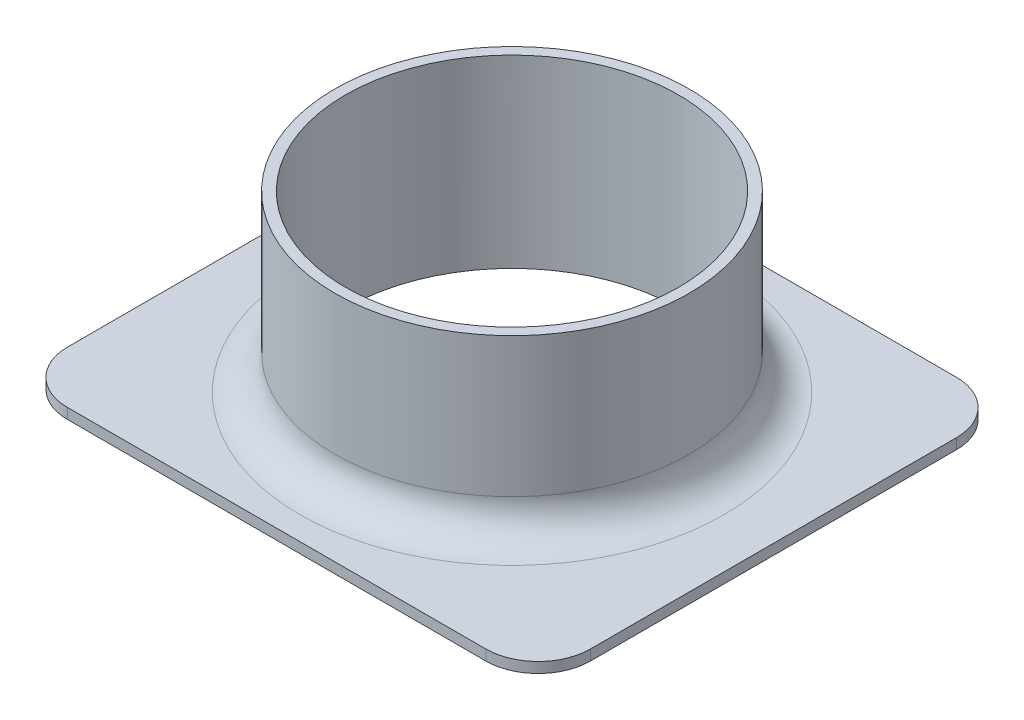
ISO-10303-21;
HEADER;
FILE_DESCRIPTION(('STEP AP214'),'2;1');
FILE_NAME('part.step','',(''),(''),'','','');
FILE_SCHEMA(('AUTOMOTIVE_DESIGN { 1 0 10303 214 1 1 1 1 }'));
ENDSEC;
DATA;
#1=APPLICATION_CONTEXT('core data for automotive mechanical design processes');
#2=APPLICATION_PROTOCOL_DEFINITION('international standard','automotive_design',2000,#1);
#3=PRODUCT_CONTEXT('',#1,'mechanical');
#4=PRODUCT('Part','Part','',(#3));
#5=PRODUCT_RELATED_PRODUCT_CATEGORY('part','',(#4));
#6=PRODUCT_DEFINITION_FORMATION('','',#4);
#7=PRODUCT_DEFINITION_CONTEXT('part definition',#1,'design');
#8=PRODUCT_DEFINITION('design','',#6,#7);
#9=PRODUCT_DEFINITION_SHAPE('','',#8);
#10=(LENGTH_UNIT() NAMED_UNIT(*) SI_UNIT(.MILLI.,.METRE.));
#11=(NAMED_UNIT(*) PLANE_ANGLE_UNIT() SI_UNIT($,.RADIAN.));
#12=(NAMED_UNIT(*) SI_UNIT($,.STERADIAN.) SOLID_ANGLE_UNIT());
#13=UNCERTAINTY_MEASURE_WITH_UNIT(LENGTH_MEASURE(1.E-05),#10,'distance_accuracy_value','');
#14=(GEOMETRIC_REPRESENTATION_CONTEXT(3) GLOBAL_UNCERTAINTY_ASSIGNED_CONTEXT((#13)) GLOBAL_UNIT_ASSIGNED_CONTEXT((#10,
#11,#12)) REPRESENTATION_CONTEXT('',''));
#15=CARTESIAN_POINT('',(0.,0.,0.));
#16=DIRECTION('',(0.,0.,1.));
#17=DIRECTION('',(1.,0.,0.));
#18=AXIS2_PLACEMENT_3D('',#15,#16,#17);
#19=CARTESIAN_POINT('',(0.,50.,0.));
#20=DIRECTION('',(0.,1.,0.));
#21=DIRECTION('',(0.,0.,1.));
#22=AXIS2_PLACEMENT_3D('',#19,#20,#21);
#23=PLANE('',#22);
#24=CARTESIAN_POINT('',(0.,50.,0.));
#25=DIRECTION('',(0.,1.,0.));
#26=DIRECTION('',(0.,0.,1.));
#27=AXIS2_PLACEMENT_3D('',#24,#25,#26);
#28=CIRCLE('',#27,50.8);
#29=CARTESIAN_POINT('',(0.,50.,50.8));
#30=VERTEX_POINT('',#29);
#31=EDGE_CURVE('E151',#30,#30,#28,.T.);
#32=ORIENTED_EDGE('',*,*,#31,.T.);
#33=EDGE_LOOP('',(#32));
#34=FACE_BOUND('',#33,.T.);
#35=CARTESIAN_POINT('',(0.,50.,0.));
#36=DIRECTION('',(0.,1.,0.));
#37=DIRECTION('',(1.,0.,0.));
#38=AXIS2_PLACEMENT_3D('',#35,#36,#37);
#39=CIRCLE('',#38,47.8);
#40=CARTESIAN_POINT('',(47.8,50.,0.));
#41=VERTEX_POINT('',#40);
#42=EDGE_CURVE('E148',#41,#41,#39,.T.);
#43=ORIENTED_EDGE('',*,*,#42,.F.);
#44=EDGE_LOOP('',(#43));
#45=FACE_BOUND('',#44,.T.);
#46=ADVANCED_FACE('F47',(#34,#45),#23,.T.);
#47=CARTESIAN_POINT('',(0.,50.,0.));
#48=DIRECTION('',(0.,-1.,0.));
#49=DIRECTION('',(0.,0.,-1.));
#50=AXIS2_PLACEMENT_3D('',#47,#48,#49);
#51=CYLINDRICAL_SURFACE('',#50,50.8);
#52=CARTESIAN_POINT('',(0.,10.,0.));
#53=DIRECTION('',(0.,1.,0.));
#54=DIRECTION('',(0.,0.,1.));
#55=AXIS2_PLACEMENT_3D('',#52,#53,#54);
#56=CIRCLE('',#55,50.8);
#57=CARTESIAN_POINT('',(0.,10.,50.8));
#58=VERTEX_POINT('',#57);
#59=EDGE_CURVE('E154',#58,#58,#56,.T.);
#60=ORIENTED_EDGE('',*,*,#59,.T.);
#61=EDGE_LOOP('',(#60));
#62=FACE_BOUND('',#61,.T.);
#63=ORIENTED_EDGE('',*,*,#31,.F.);
#64=EDGE_LOOP('',(#63));
#65=FACE_BOUND('',#64,.T.);
#66=ADVANCED_FACE('F219',(#62,#65),#51,.T.);
#67=CARTESIAN_POINT('',(0.,50.,0.));
#68=DIRECTION('',(0.,-1.,0.));
#69=DIRECTION('',(0.,0.,-1.));
#70=AXIS2_PLACEMENT_3D('',#67,#68,#69);
#71=CYLINDRICAL_SURFACE('',#70,47.8);
#72=ORIENTED_EDGE('',*,*,#42,.T.);
#73=EDGE_LOOP('',(#72));
#74=FACE_BOUND('',#73,.T.);
#75=CARTESIAN_POINT('',(0.,-3.,0.));
#76=DIRECTION('',(0.,1.,0.));
#77=DIRECTION('',(0.,0.,1.));
#78=AXIS2_PLACEMENT_3D('',#75,#76,#77);
#79=CIRCLE('',#78,47.8);
#80=CARTESIAN_POINT('',(0.,-3.,47.8));
#81=VERTEX_POINT('',#80);
#82=EDGE_CURVE('E189',#81,#81,#79,.T.);
#83=ORIENTED_EDGE('',*,*,#82,.F.);
#84=EDGE_LOOP('',(#83));
#85=FACE_BOUND('',#84,.T.);
#86=ADVANCED_FACE('F225',(#74,#85),#71,.F.);
#87=CARTESIAN_POINT('',(-75.,-3.,67.5));
#88=DIRECTION('',(1.,0.,0.));
#89=DIRECTION('',(0.,0.,-1.));
#90=AXIS2_PLACEMENT_3D('',#87,#88,#89);
#91=PLANE('',#90);
#92=DIRECTION('',(0.,0.,-1.));
#93=VECTOR('',#92,1.);
#94=CARTESIAN_POINT('',(-75.,-3.,67.5));
#95=LINE('',#94,#93);
#96=CARTESIAN_POINT('',(-75.,-3.,52.5));
#97=VERTEX_POINT('',#96);
#98=CARTESIAN_POINT('',(-75.,-3.,-52.5));
#99=VERTEX_POINT('',#98);
#100=EDGE_CURVE('E139',#97,#99,#95,.T.);
#101=ORIENTED_EDGE('',*,*,#100,.F.);
#102=DIRECTION('',(0.,1.,0.));
#103=VECTOR('',#102,1.);
#104=CARTESIAN_POINT('',(-75.,-3.,52.5));
#105=LINE('',#104,#103);
#106=CARTESIAN_POINT('',(-75.,0.,52.5));
#107=VERTEX_POINT('',#106);
#108=EDGE_CURVE('E177',#97,#107,#105,.T.);
#109=ORIENTED_EDGE('',*,*,#108,.T.);
#110=DIRECTION('',(0.,0.,-1.));
#111=VECTOR('',#110,1.);
#112=CARTESIAN_POINT('',(-75.,0.,67.5));
#113=LINE('',#112,#111);
#114=CARTESIAN_POINT('',(-75.,0.,-52.5));
#115=VERTEX_POINT('',#114);
#116=EDGE_CURVE('E184',#107,#115,#113,.T.);
#117=ORIENTED_EDGE('',*,*,#116,.T.);
#118=DIRECTION('',(0.,1.,0.));
#119=VECTOR('',#118,1.);
#120=CARTESIAN_POINT('',(-75.,-3.,-52.5));
#121=LINE('',#120,#119);
#122=EDGE_CURVE('E175',#115,#99,#121,.F.);
#123=ORIENTED_EDGE('',*,*,#122,.T.);
#124=EDGE_LOOP('',(#101,#109,#117,#123));
#125=FACE_BOUND('',#124,.T.);
#126=ADVANCED_FACE('F183',(#125),#91,.F.);
#127=CARTESIAN_POINT('',(75.,-3.,-67.5));
#128=DIRECTION('',(0.,0.,1.));
#129=DIRECTION('',(1.,0.,0.));
#130=AXIS2_PLACEMENT_3D('',#127,#128,#129);
#131=PLANE('',#130);
#132=DIRECTION('',(1.,0.,0.));
#133=VECTOR('',#132,1.);
#134=CARTESIAN_POINT('',(75.,-3.,-67.5));
#135=LINE('',#134,#133);
#136=CARTESIAN_POINT('',(-60.,-3.,-67.5));
#137=VERTEX_POINT('',#136);
#138=CARTESIAN_POINT('',(60.,-3.,-67.5));
#139=VERTEX_POINT('',#138);
#140=EDGE_CURVE('E142',#137,#139,#135,.T.);
#141=ORIENTED_EDGE('',*,*,#140,.F.);
#142=DIRECTION('',(0.,1.,0.));
#143=VECTOR('',#142,1.);
#144=CARTESIAN_POINT('',(-60.,-3.,-67.5));
#145=LINE('',#144,#143);
#146=CARTESIAN_POINT('',(-60.,0.,-67.5));
#147=VERTEX_POINT('',#146);
#148=EDGE_CURVE('E12',#137,#147,#145,.T.);
#149=ORIENTED_EDGE('',*,*,#148,.T.);
#150=DIRECTION('',(1.,0.,0.));
#151=VECTOR('',#150,1.);
#152=CARTESIAN_POINT('',(75.,0.,-67.5));
#153=LINE('',#152,#151);
#154=CARTESIAN_POINT('',(60.,0.,-67.5));
#155=VERTEX_POINT('',#154);
#156=EDGE_CURVE('E144',#147,#155,#153,.T.);
#157=ORIENTED_EDGE('',*,*,#156,.T.);
#158=DIRECTION('',(0.,1.,0.));
#159=VECTOR('',#158,1.);
#160=CARTESIAN_POINT('',(60.,-3.,-67.5));
#161=LINE('',#160,#159);
#162=EDGE_CURVE('E55',#155,#139,#161,.F.);
#163=ORIENTED_EDGE('',*,*,#162,.T.);
#164=EDGE_LOOP('',(#141,#149,#157,#163));
#165=FACE_BOUND('',#164,.T.);
#166=ADVANCED_FACE('F206',(#165),#131,.F.);
#167=CARTESIAN_POINT('',(75.,-3.,67.5));
#168=DIRECTION('',(-1.,0.,0.));
#169=DIRECTION('',(0.,0.,1.));
#170=AXIS2_PLACEMENT_3D('',#167,#168,#169);
#171=PLANE('',#170);
#172=DIRECTION('',(0.,0.,1.));
#173=VECTOR('',#172,1.);
#174=CARTESIAN_POINT('',(75.,0.,67.5));
#175=LINE('',#174,#173);
#176=CARTESIAN_POINT('',(75.,0.,-52.5));
#177=VERTEX_POINT('',#176);
#178=CARTESIAN_POINT('',(75.,0.,52.5));
#179=VERTEX_POINT('',#178);
#180=EDGE_CURVE('E140',#177,#179,#175,.T.);
#181=ORIENTED_EDGE('',*,*,#180,.T.);
#182=DIRECTION('',(0.,1.,0.));
#183=VECTOR('',#182,1.);
#184=CARTESIAN_POINT('',(75.,-3.,52.5));
#185=LINE('',#184,#183);
#186=CARTESIAN_POINT('',(75.,-3.,52.5));
#187=VERTEX_POINT('',#186);
#188=EDGE_CURVE('E118',#179,#187,#185,.F.);
#189=ORIENTED_EDGE('',*,*,#188,.T.);
#190=DIRECTION('',(0.,0.,1.));
#191=VECTOR('',#190,1.);
#192=CARTESIAN_POINT('',(75.,-3.,67.5));
#193=LINE('',#192,#191);
#194=CARTESIAN_POINT('',(75.,-3.,-52.5));
#195=VERTEX_POINT('',#194);
#196=EDGE_CURVE('E195',#195,#187,#193,.T.);
#197=ORIENTED_EDGE('',*,*,#196,.F.);
#198=DIRECTION('',(0.,1.,0.));
#199=VECTOR('',#198,1.);
#200=CARTESIAN_POINT('',(75.,-3.,-52.5));
#201=LINE('',#200,#199);
#202=EDGE_CURVE('E123',#195,#177,#201,.T.);
#203=ORIENTED_EDGE('',*,*,#202,.T.);
#204=EDGE_LOOP('',(#181,#189,#197,#203));
#205=FACE_BOUND('',#204,.T.);
#206=ADVANCED_FACE('F205',(#205),#171,.F.);
#207=CARTESIAN_POINT('',(75.,-3.,67.5));
#208=DIRECTION('',(0.,0.,-1.));
#209=DIRECTION('',(-1.,0.,0.));
#210=AXIS2_PLACEMENT_3D('',#207,#208,#209);
#211=PLANE('',#210);
#212=DIRECTION('',(-1.,0.,0.));
#213=VECTOR('',#212,1.);
#214=CARTESIAN_POINT('',(75.,-3.,67.5));
#215=LINE('',#214,#213);
#216=CARTESIAN_POINT('',(60.,-3.,67.5));
#217=VERTEX_POINT('',#216);
#218=CARTESIAN_POINT('',(-60.,-3.,67.5));
#219=VERTEX_POINT('',#218);
#220=EDGE_CURVE('E133',#217,#219,#215,.T.);
#221=ORIENTED_EDGE('',*,*,#220,.F.);
#222=DIRECTION('',(0.,1.,0.));
#223=VECTOR('',#222,1.);
#224=CARTESIAN_POINT('',(60.,-3.,67.5));
#225=LINE('',#224,#223);
#226=CARTESIAN_POINT('',(60.,0.,67.5));
#227=VERTEX_POINT('',#226);
#228=EDGE_CURVE('E117',#217,#227,#225,.T.);
#229=ORIENTED_EDGE('',*,*,#228,.T.);
#230=DIRECTION('',(-1.,0.,0.));
#231=VECTOR('',#230,1.);
#232=CARTESIAN_POINT('',(75.,0.,67.5));
#233=LINE('',#232,#231);
#234=CARTESIAN_POINT('',(-60.,0.,67.5));
#235=VERTEX_POINT('',#234);
#236=EDGE_CURVE('E130',#227,#235,#233,.T.);
#237=ORIENTED_EDGE('',*,*,#236,.T.);
#238=DIRECTION('',(0.,1.,0.));
#239=VECTOR('',#238,1.);
#240=CARTESIAN_POINT('',(-60.,-3.,67.5));
#241=LINE('',#240,#239);
#242=EDGE_CURVE('E135',#235,#219,#241,.F.);
#243=ORIENTED_EDGE('',*,*,#242,.T.);
#244=EDGE_LOOP('',(#221,#229,#237,#243));
#245=FACE_BOUND('',#244,.T.);
#246=ADVANCED_FACE('F129',(#245),#211,.F.);
#247=CARTESIAN_POINT('',(0.,-3.,0.));
#248=DIRECTION('',(0.,1.,0.));
#249=DIRECTION('',(0.,0.,1.));
#250=AXIS2_PLACEMENT_3D('',#247,#248,#249);
#251=PLANE('',#250);
#252=ORIENTED_EDGE('',*,*,#82,.T.);
#253=EDGE_LOOP('',(#252));
#254=FACE_BOUND('',#253,.T.);
#255=ORIENTED_EDGE('',*,*,#196,.T.);
#256=CARTESIAN_POINT('',(60.,-3.,52.5));
#257=DIRECTION('',(0.,1.,0.));
#258=DIRECTION('',(0.,0.,1.));
#259=AXIS2_PLACEMENT_3D('',#256,#257,#258);
#260=CIRCLE('',#259,15.);
#261=EDGE_CURVE('E173',#187,#217,#260,.F.);
#262=ORIENTED_EDGE('',*,*,#261,.T.);
#263=ORIENTED_EDGE('',*,*,#220,.T.);
#264=CARTESIAN_POINT('',(-60.,-3.,52.5));
#265=DIRECTION('',(0.,1.,0.));
#266=DIRECTION('',(0.,0.,1.));
#267=AXIS2_PLACEMENT_3D('',#264,#265,#266);
#268=CIRCLE('',#267,15.);
#269=EDGE_CURVE('E171',#219,#97,#268,.F.);
#270=ORIENTED_EDGE('',*,*,#269,.T.);
#271=ORIENTED_EDGE('',*,*,#100,.T.);
#272=CARTESIAN_POINT('',(-60.,-3.,-52.5));
#273=DIRECTION('',(0.,1.,0.));
#274=DIRECTION('',(0.,0.,1.));
#275=AXIS2_PLACEMENT_3D('',#272,#273,#274);
#276=CIRCLE('',#275,15.);
#277=EDGE_CURVE('E68',#99,#137,#276,.F.);
#278=ORIENTED_EDGE('',*,*,#277,.T.);
#279=ORIENTED_EDGE('',*,*,#140,.T.);
#280=CARTESIAN_POINT('',(60.,-3.,-52.5));
#281=DIRECTION('',(0.,1.,0.));
#282=DIRECTION('',(0.,0.,1.));
#283=AXIS2_PLACEMENT_3D('',#280,#281,#282);
#284=CIRCLE('',#283,15.);
#285=EDGE_CURVE('E168',#139,#195,#284,.F.);
#286=ORIENTED_EDGE('',*,*,#285,.T.);
#287=EDGE_LOOP('',(#255,#262,#263,#270,#271,#278,#279,#286));
#288=FACE_BOUND('',#287,.T.);
#289=ADVANCED_FACE('F199',(#254,#288),#251,.F.);
#290=CARTESIAN_POINT('',(0.,0.,0.));
#291=DIRECTION('',(0.,1.,0.));
#292=DIRECTION('',(0.,0.,1.));
#293=AXIS2_PLACEMENT_3D('',#290,#291,#292);
#294=PLANE('',#293);
#295=CARTESIAN_POINT('',(0.,0.,0.));
#296=DIRECTION('',(0.,1.,0.));
#297=DIRECTION('',(0.,0.,1.));
#298=AXIS2_PLACEMENT_3D('',#295,#296,#297);
#299=CIRCLE('',#298,60.8);
#300=CARTESIAN_POINT('',(0.,0.,60.8));
#301=VERTEX_POINT('',#300);
#302=EDGE_CURVE('E157',#301,#301,#299,.F.);
#303=ORIENTED_EDGE('',*,*,#302,.T.);
#304=EDGE_LOOP('',(#303));
#305=FACE_BOUND('',#304,.T.);
#306=ORIENTED_EDGE('',*,*,#236,.F.);
#307=CARTESIAN_POINT('',(60.,0.,52.5));
#308=DIRECTION('',(0.,1.,0.));
#309=DIRECTION('',(0.,0.,1.));
#310=AXIS2_PLACEMENT_3D('',#307,#308,#309);
#311=CIRCLE('',#310,15.);
#312=EDGE_CURVE('E113',#227,#179,#311,.T.);
#313=ORIENTED_EDGE('',*,*,#312,.T.);
#314=ORIENTED_EDGE('',*,*,#180,.F.);
#315=CARTESIAN_POINT('',(60.,0.,-52.5));
#316=DIRECTION('',(0.,1.,0.));
#317=DIRECTION('',(0.,0.,1.));
#318=AXIS2_PLACEMENT_3D('',#315,#316,#317);
#319=CIRCLE('',#318,15.);
#320=EDGE_CURVE('E134',#177,#155,#319,.T.);
#321=ORIENTED_EDGE('',*,*,#320,.T.);
#322=ORIENTED_EDGE('',*,*,#156,.F.);
#323=CARTESIAN_POINT('',(-60.,0.,-52.5));
#324=DIRECTION('',(0.,1.,0.));
#325=DIRECTION('',(0.,0.,1.));
#326=AXIS2_PLACEMENT_3D('',#323,#324,#325);
#327=CIRCLE('',#326,15.);
#328=EDGE_CURVE('E162',#147,#115,#327,.T.);
#329=ORIENTED_EDGE('',*,*,#328,.T.);
#330=ORIENTED_EDGE('',*,*,#116,.F.);
#331=CARTESIAN_POINT('',(-60.,0.,52.5));
#332=DIRECTION('',(0.,1.,0.));
#333=DIRECTION('',(0.,0.,1.));
#334=AXIS2_PLACEMENT_3D('',#331,#332,#333);
#335=CIRCLE('',#334,15.);
#336=EDGE_CURVE('E124',#107,#235,#335,.T.);
#337=ORIENTED_EDGE('',*,*,#336,.T.);
#338=EDGE_LOOP('',(#306,#313,#314,#321,#322,#329,#330,#337));
#339=FACE_BOUND('',#338,.T.);
#340=ADVANCED_FACE('F137',(#305,#339),#294,.T.);
#341=CARTESIAN_POINT('',(0.,10.,0.));
#342=DIRECTION('',(0.,1.,0.));
#343=DIRECTION('',(0.,0.,1.));
#344=AXIS2_PLACEMENT_3D('',#341,#342,#343);
#345=TOROIDAL_SURFACE('',#344,60.8,10.);
#346=ORIENTED_EDGE('',*,*,#302,.F.);
#347=EDGE_LOOP('',(#346));
#348=FACE_BOUND('',#347,.T.);
#349=ORIENTED_EDGE('',*,*,#59,.F.);
#350=EDGE_LOOP('',(#349));
#351=FACE_BOUND('',#350,.T.);
#352=ADVANCED_FACE('F216',(#348,#351),#345,.F.);
#353=CARTESIAN_POINT('',(60.,-3.,52.5));
#354=DIRECTION('',(0.,1.,0.));
#355=DIRECTION('',(0.,0.,1.));
#356=AXIS2_PLACEMENT_3D('',#353,#354,#355);
#357=CYLINDRICAL_SURFACE('',#356,15.);
#358=ORIENTED_EDGE('',*,*,#261,.F.);
#359=ORIENTED_EDGE('',*,*,#188,.F.);
#360=ORIENTED_EDGE('',*,*,#312,.F.);
#361=ORIENTED_EDGE('',*,*,#228,.F.);
#362=EDGE_LOOP('',(#358,#359,#360,#361));
#363=FACE_BOUND('',#362,.T.);
#364=ADVANCED_FACE('F116',(#363),#357,.T.);
#365=CARTESIAN_POINT('',(-60.,-3.,52.5));
#366=DIRECTION('',(0.,1.,0.));
#367=DIRECTION('',(0.,0.,1.));
#368=AXIS2_PLACEMENT_3D('',#365,#366,#367);
#369=CYLINDRICAL_SURFACE('',#368,15.);
#370=ORIENTED_EDGE('',*,*,#269,.F.);
#371=ORIENTED_EDGE('',*,*,#242,.F.);
#372=ORIENTED_EDGE('',*,*,#336,.F.);
#373=ORIENTED_EDGE('',*,*,#108,.F.);
#374=EDGE_LOOP('',(#370,#371,#372,#373));
#375=FACE_BOUND('',#374,.T.);
#376=ADVANCED_FACE('F209',(#375),#369,.T.);
#377=CARTESIAN_POINT('',(-60.,-3.,-52.5));
#378=DIRECTION('',(0.,1.,0.));
#379=DIRECTION('',(0.,0.,1.));
#380=AXIS2_PLACEMENT_3D('',#377,#378,#379);
#381=CYLINDRICAL_SURFACE('',#380,15.);
#382=ORIENTED_EDGE('',*,*,#277,.F.);
#383=ORIENTED_EDGE('',*,*,#122,.F.);
#384=ORIENTED_EDGE('',*,*,#328,.F.);
#385=ORIENTED_EDGE('',*,*,#148,.F.);
#386=EDGE_LOOP('',(#382,#383,#384,#385));
#387=FACE_BOUND('',#386,.T.);
#388=ADVANCED_FACE('F208',(#387),#381,.T.);
#389=CARTESIAN_POINT('',(60.,-3.,-52.5));
#390=DIRECTION('',(0.,1.,0.));
#391=DIRECTION('',(0.,0.,1.));
#392=AXIS2_PLACEMENT_3D('',#389,#390,#391);
#393=CYLINDRICAL_SURFACE('',#392,15.);
#394=ORIENTED_EDGE('',*,*,#285,.F.);
#395=ORIENTED_EDGE('',*,*,#162,.F.);
#396=ORIENTED_EDGE('',*,*,#320,.F.);
#397=ORIENTED_EDGE('',*,*,#202,.F.);
#398=EDGE_LOOP('',(#394,#395,#396,#397));
#399=FACE_BOUND('',#398,.T.);
#400=ADVANCED_FACE('F49',(#399),#393,.T.);
#401=CLOSED_SHELL('',(#46,#66,#86,#126,#166,#206,#246,#289,#340,#352,#364,#376,#388,#400));
#402=MANIFOLD_SOLID_BREP('B2',#401);
#403=ADVANCED_BREP_SHAPE_REPRESENTATION('',(#18,#402),#14);
#404=SHAPE_DEFINITION_REPRESENTATION(#9,#403);
ENDSEC;
END-ISO-10303-21;
